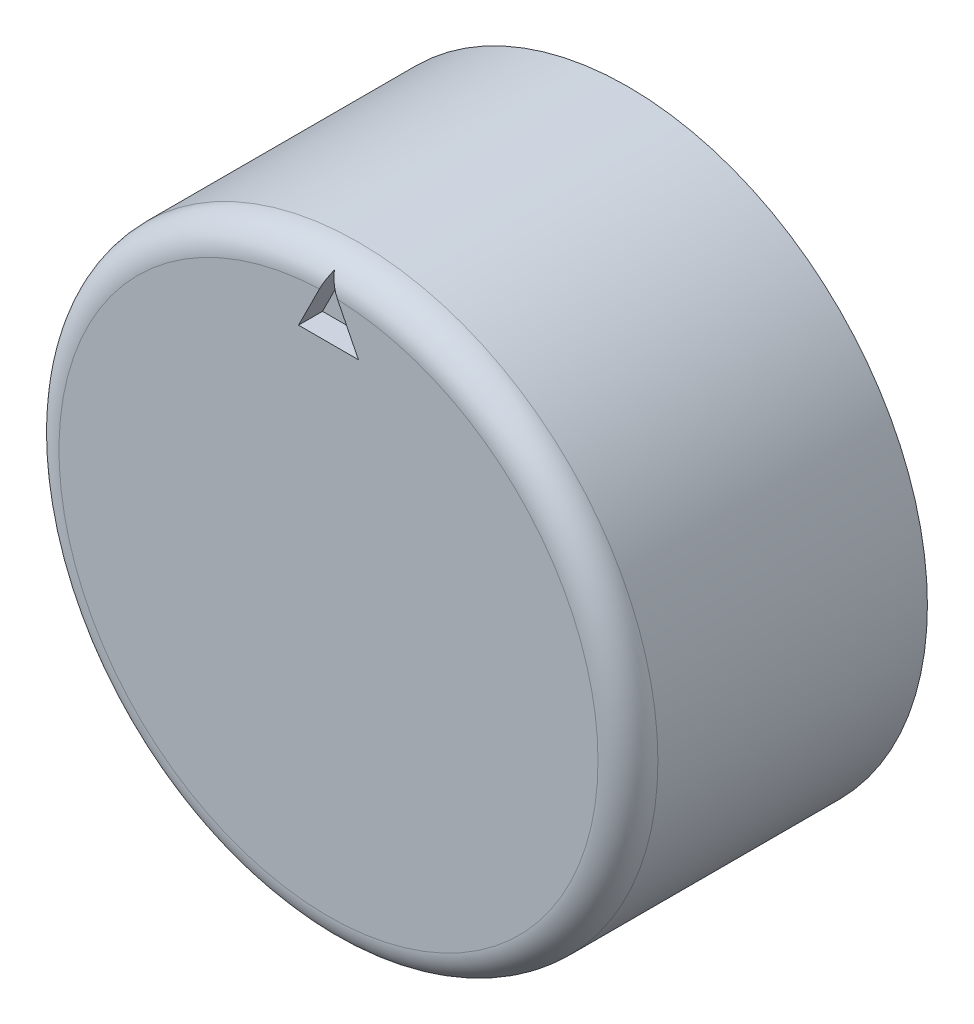
ISO-10303-21;
HEADER;
FILE_DESCRIPTION(('STEP AP214'),'2;1');
FILE_NAME('part.step','',(''),(''),'','','');
FILE_SCHEMA(('AUTOMOTIVE_DESIGN { 1 0 10303 214 1 1 1 1 }'));
ENDSEC;
DATA;
#1=APPLICATION_CONTEXT('core data for automotive mechanical design processes');
#2=APPLICATION_PROTOCOL_DEFINITION('international standard','automotive_design',2000,#1);
#3=PRODUCT_CONTEXT('',#1,'mechanical');
#4=PRODUCT('Part','Part','',(#3));
#5=PRODUCT_RELATED_PRODUCT_CATEGORY('part','',(#4));
#6=PRODUCT_DEFINITION_FORMATION('','',#4);
#7=PRODUCT_DEFINITION_CONTEXT('part definition',#1,'design');
#8=PRODUCT_DEFINITION('design','',#6,#7);
#9=PRODUCT_DEFINITION_SHAPE('','',#8);
#10=(LENGTH_UNIT() NAMED_UNIT(*) SI_UNIT(.MILLI.,.METRE.));
#11=(NAMED_UNIT(*) PLANE_ANGLE_UNIT() SI_UNIT($,.RADIAN.));
#12=(NAMED_UNIT(*) SI_UNIT($,.STERADIAN.) SOLID_ANGLE_UNIT());
#13=UNCERTAINTY_MEASURE_WITH_UNIT(LENGTH_MEASURE(1.E-05),#10,'distance_accuracy_value','');
#14=(GEOMETRIC_REPRESENTATION_CONTEXT(3) GLOBAL_UNCERTAINTY_ASSIGNED_CONTEXT((#13)) GLOBAL_UNIT_ASSIGNED_CONTEXT((#10,
#11,#12)) REPRESENTATION_CONTEXT('',''));
#15=CARTESIAN_POINT('',(0.,0.,0.));
#16=DIRECTION('',(0.,0.,1.));
#17=DIRECTION('',(1.,0.,0.));
#18=AXIS2_PLACEMENT_3D('',#15,#16,#17);
#19=CARTESIAN_POINT('',(0.,0.,12.7));
#20=DIRECTION('',(0.,0.,1.));
#21=DIRECTION('',(1.,0.,0.));
#22=AXIS2_PLACEMENT_3D('',#19,#20,#21);
#23=PLANE('',#22);
#24=DIRECTION('',(-0.447213595499958,-0.894427190999916,0.));
#25=VECTOR('',#24,1.);
#26=CARTESIAN_POINT('',(0.,12.192,12.7));
#27=LINE('',#26,#25);
#28=CARTESIAN_POINT('',(-0.384229973834575,11.4235400523308,12.7));
#29=VERTEX_POINT('',#28);
#30=CARTESIAN_POINT('',(-1.27,9.652,12.7));
#31=VERTEX_POINT('',#30);
#32=EDGE_CURVE('E124',#29,#31,#27,.T.);
#33=ORIENTED_EDGE('',*,*,#32,.F.);
#34=CARTESIAN_POINT('',(0.,0.,12.7));
#35=DIRECTION('',(0.,0.,1.));
#36=DIRECTION('',(1.,0.,0.));
#37=AXIS2_PLACEMENT_3D('',#34,#35,#36);
#38=CIRCLE('',#37,11.43);
#39=CARTESIAN_POINT('',(0.384229973834575,11.4235400523308,12.7));
#40=VERTEX_POINT('',#39);
#41=EDGE_CURVE('E218',#29,#40,#38,.T.);
#42=ORIENTED_EDGE('',*,*,#41,.T.);
#43=DIRECTION('',(0.447213595499958,-0.894427190999916,0.));
#44=VECTOR('',#43,1.);
#45=CARTESIAN_POINT('',(0.,12.192,12.7));
#46=LINE('',#45,#44);
#47=CARTESIAN_POINT('',(1.27,9.652,12.7));
#48=VERTEX_POINT('',#47);
#49=EDGE_CURVE('E143',#40,#48,#46,.T.);
#50=ORIENTED_EDGE('',*,*,#49,.T.);
#51=DIRECTION('',(1.,0.,0.));
#52=VECTOR('',#51,1.);
#53=CARTESIAN_POINT('',(-1.27,9.652,12.7));
#54=LINE('',#53,#52);
#55=EDGE_CURVE('E131',#31,#48,#54,.T.);
#56=ORIENTED_EDGE('',*,*,#55,.F.);
#57=EDGE_LOOP('',(#33,#42,#50,#56));
#58=FACE_BOUND('',#57,.T.);
#59=ADVANCED_FACE('F38',(#58),#23,.T.);
#60=CARTESIAN_POINT('',(0.,0.,12.7));
#61=DIRECTION('',(0.,0.,-1.));
#62=DIRECTION('',(-1.,0.,0.));
#63=AXIS2_PLACEMENT_3D('',#60,#61,#62);
#64=CYLINDRICAL_SURFACE('',#63,12.7);
#65=CARTESIAN_POINT('',(0.,0.,11.43));
#66=DIRECTION('',(0.,0.,1.));
#67=DIRECTION('',(1.,0.,0.));
#68=AXIS2_PLACEMENT_3D('',#65,#66,#67);
#69=CIRCLE('',#68,12.7);
#70=CARTESIAN_POINT('',(12.7,0.,11.43));
#71=VERTEX_POINT('',#70);
#72=EDGE_CURVE('E337',#71,#71,#69,.F.);
#73=ORIENTED_EDGE('',*,*,#72,.T.);
#74=EDGE_LOOP('',(#73));
#75=FACE_BOUND('',#74,.T.);
#76=CARTESIAN_POINT('',(0.,0.,0.));
#77=DIRECTION('',(0.,0.,1.));
#78=DIRECTION('',(1.,0.,0.));
#79=AXIS2_PLACEMENT_3D('',#76,#77,#78);
#80=CIRCLE('',#79,12.7);
#81=CARTESIAN_POINT('',(12.7,0.,0.));
#82=VERTEX_POINT('',#81);
#83=EDGE_CURVE('E182',#82,#82,#80,.T.);
#84=ORIENTED_EDGE('',*,*,#83,.T.);
#85=EDGE_LOOP('',(#84));
#86=FACE_BOUND('',#85,.T.);
#87=ADVANCED_FACE('F292',(#75,#86),#64,.T.);
#88=CARTESIAN_POINT('',(0.,0.,0.));
#89=DIRECTION('',(0.,0.,1.));
#90=DIRECTION('',(1.,0.,0.));
#91=AXIS2_PLACEMENT_3D('',#88,#89,#90);
#92=PLANE('',#91);
#93=CARTESIAN_POINT('',(0.,0.,0.));
#94=DIRECTION('',(0.,0.,1.));
#95=DIRECTION('',(1.,0.,0.));
#96=AXIS2_PLACEMENT_3D('',#93,#94,#95);
#97=CIRCLE('',#96,11.43);
#98=CARTESIAN_POINT('',(11.43,0.,0.));
#99=VERTEX_POINT('',#98);
#100=EDGE_CURVE('E214',#99,#99,#97,.T.);
#101=ORIENTED_EDGE('',*,*,#100,.T.);
#102=EDGE_LOOP('',(#101));
#103=FACE_BOUND('',#102,.T.);
#104=ORIENTED_EDGE('',*,*,#83,.F.);
#105=EDGE_LOOP('',(#104));
#106=FACE_BOUND('',#105,.T.);
#107=ADVANCED_FACE('F294',(#103,#106),#92,.F.);
#108=CARTESIAN_POINT('',(0.,0.,10.16));
#109=DIRECTION('',(0.,0.,-1.));
#110=DIRECTION('',(-1.,0.,0.));
#111=AXIS2_PLACEMENT_3D('',#108,#109,#110);
#112=CYLINDRICAL_SURFACE('',#111,10.16);
#113=CARTESIAN_POINT('',(0.,0.,8.89));
#114=DIRECTION('',(0.,0.,-1.));
#115=DIRECTION('',(-1.,0.,0.));
#116=AXIS2_PLACEMENT_3D('',#113,#114,#115);
#117=CIRCLE('',#116,10.16);
#118=CARTESIAN_POINT('',(-10.16,0.,8.89));
#119=VERTEX_POINT('',#118);
#120=EDGE_CURVE('E198',#119,#119,#117,.F.);
#121=ORIENTED_EDGE('',*,*,#120,.T.);
#122=EDGE_LOOP('',(#121));
#123=FACE_BOUND('',#122,.T.);
#124=CARTESIAN_POINT('',(0.,0.,1.27));
#125=DIRECTION('',(0.,0.,1.));
#126=DIRECTION('',(1.,0.,0.));
#127=AXIS2_PLACEMENT_3D('',#124,#125,#126);
#128=CIRCLE('',#127,10.16);
#129=CARTESIAN_POINT('',(10.16,0.,1.27));
#130=VERTEX_POINT('',#129);
#131=EDGE_CURVE('E194',#130,#130,#128,.F.);
#132=ORIENTED_EDGE('',*,*,#131,.T.);
#133=EDGE_LOOP('',(#132));
#134=FACE_BOUND('',#133,.T.);
#135=ADVANCED_FACE('F297',(#123,#134),#112,.F.);
#136=CARTESIAN_POINT('',(0.,0.,10.16));
#137=DIRECTION('',(0.,0.,-1.));
#138=DIRECTION('',(-1.,0.,0.));
#139=AXIS2_PLACEMENT_3D('',#136,#137,#138);
#140=PLANE('',#139);
#141=CARTESIAN_POINT('',(0.,0.,10.16));
#142=DIRECTION('',(0.,0.,-1.));
#143=DIRECTION('',(-1.,0.,0.));
#144=AXIS2_PLACEMENT_3D('',#141,#142,#143);
#145=CIRCLE('',#144,8.89);
#146=CARTESIAN_POINT('',(-8.89,0.,10.16));
#147=VERTEX_POINT('',#146);
#148=EDGE_CURVE('E190',#147,#147,#145,.T.);
#149=ORIENTED_EDGE('',*,*,#148,.T.);
#150=EDGE_LOOP('',(#149));
#151=FACE_BOUND('',#150,.T.);
#152=CARTESIAN_POINT('',(0.,0.,10.16));
#153=DIRECTION('',(0.,0.,-1.));
#154=DIRECTION('',(-1.,0.,0.));
#155=AXIS2_PLACEMENT_3D('',#152,#153,#154);
#156=CIRCLE('',#155,6.35);
#157=CARTESIAN_POINT('',(-6.35,0.,10.16));
#158=VERTEX_POINT('',#157);
#159=EDGE_CURVE('E186',#158,#158,#156,.F.);
#160=ORIENTED_EDGE('',*,*,#159,.T.);
#161=EDGE_LOOP('',(#160));
#162=FACE_BOUND('',#161,.T.);
#163=ADVANCED_FACE('F371',(#151,#162),#140,.T.);
#164=CARTESIAN_POINT('',(0.,0.,10.16));
#165=DIRECTION('',(0.,0.,-1.));
#166=DIRECTION('',(-1.,0.,0.));
#167=AXIS2_PLACEMENT_3D('',#164,#165,#166);
#168=CYLINDRICAL_SURFACE('',#167,5.08);
#169=CARTESIAN_POINT('',(0.,0.,8.89));
#170=DIRECTION('',(0.,0.,-1.));
#171=DIRECTION('',(-1.,0.,0.));
#172=AXIS2_PLACEMENT_3D('',#169,#170,#171);
#173=CIRCLE('',#172,5.08);
#174=CARTESIAN_POINT('',(-5.08,0.,8.89));
#175=VERTEX_POINT('',#174);
#176=EDGE_CURVE('E202',#175,#175,#173,.T.);
#177=ORIENTED_EDGE('',*,*,#176,.T.);
#178=EDGE_LOOP('',(#177));
#179=FACE_BOUND('',#178,.T.);
#180=CARTESIAN_POINT('',(0.,0.,0.));
#181=DIRECTION('',(0.,0.,-1.));
#182=DIRECTION('',(-1.,0.,0.));
#183=AXIS2_PLACEMENT_3D('',#180,#181,#182);
#184=CIRCLE('',#183,5.08);
#185=CARTESIAN_POINT('',(-5.08,0.,0.));
#186=VERTEX_POINT('',#185);
#187=EDGE_CURVE('E133',#186,#186,#184,.T.);
#188=ORIENTED_EDGE('',*,*,#187,.F.);
#189=EDGE_LOOP('',(#188));
#190=FACE_BOUND('',#189,.T.);
#191=ADVANCED_FACE('F369',(#179,#190),#168,.T.);
#192=CARTESIAN_POINT('',(0.,0.,7.62));
#193=DIRECTION('',(0.,0.,-1.));
#194=DIRECTION('',(-1.,0.,0.));
#195=AXIS2_PLACEMENT_3D('',#192,#193,#194);
#196=PLANE('',#195);
#197=CARTESIAN_POINT('',(0.,0.,7.62));
#198=DIRECTION('',(0.,0.,-1.));
#199=DIRECTION('',(-1.,0.,0.));
#200=AXIS2_PLACEMENT_3D('',#197,#198,#199);
#201=CIRCLE('',#200,3.0988);
#202=CARTESIAN_POINT('',(3.07528867588069,-0.381,7.62));
#203=VERTEX_POINT('',#202);
#204=CARTESIAN_POINT('',(-3.07528867588069,-0.381,7.62));
#205=VERTEX_POINT('',#204);
#206=EDGE_CURVE('E177',#203,#205,#201,.T.);
#207=ORIENTED_EDGE('',*,*,#206,.T.);
#208=DIRECTION('',(-1.,0.,0.));
#209=VECTOR('',#208,1.);
#210=CARTESIAN_POINT('',(3.07528867588069,-0.381,7.62));
#211=LINE('',#210,#209);
#212=EDGE_CURVE('E157',#203,#205,#211,.T.);
#213=ORIENTED_EDGE('',*,*,#212,.F.);
#214=EDGE_LOOP('',(#207,#213));
#215=FACE_BOUND('',#214,.T.);
#216=ADVANCED_FACE('F281',(#215),#196,.T.);
#217=CARTESIAN_POINT('',(-3.07528867588069,0.381,7.62));
#218=VERTEX_POINT('',#217);
#219=CARTESIAN_POINT('',(3.07528867588069,0.381,7.62));
#220=VERTEX_POINT('',#219);
#221=EDGE_CURVE('E178',#218,#220,#201,.T.);
#222=ORIENTED_EDGE('',*,*,#221,.T.);
#223=DIRECTION('',(1.,0.,0.));
#224=VECTOR('',#223,1.);
#225=CARTESIAN_POINT('',(3.07528867588069,0.381,7.62));
#226=LINE('',#225,#224);
#227=EDGE_CURVE('E161',#218,#220,#226,.T.);
#228=ORIENTED_EDGE('',*,*,#227,.F.);
#229=EDGE_LOOP('',(#222,#228));
#230=FACE_BOUND('',#229,.T.);
#231=ADVANCED_FACE('F377',(#230),#196,.T.);
#232=CARTESIAN_POINT('',(3.07528867588069,0.381,6.604));
#233=DIRECTION('',(0.,-1.,0.));
#234=DIRECTION('',(0.,0.,-1.));
#235=AXIS2_PLACEMENT_3D('',#232,#233,#234);
#236=PLANE('',#235);
#237=DIRECTION('',(0.,0.,1.));
#238=VECTOR('',#237,1.);
#239=CARTESIAN_POINT('',(3.07528867588069,0.381,6.604));
#240=LINE('',#239,#238);
#241=CARTESIAN_POINT('',(3.07528867588069,0.381,6.985));
#242=VERTEX_POINT('',#241);
#243=EDGE_CURVE('E165',#242,#220,#240,.T.);
#244=ORIENTED_EDGE('',*,*,#243,.F.);
#245=DIRECTION('',(1.,0.,0.));
#246=VECTOR('',#245,1.);
#247=CARTESIAN_POINT('',(-3.07528867588069,0.381,6.985));
#248=LINE('',#247,#246);
#249=CARTESIAN_POINT('',(-3.07528867588069,0.381,6.985));
#250=VERTEX_POINT('',#249);
#251=EDGE_CURVE('E331',#242,#250,#248,.F.);
#252=ORIENTED_EDGE('',*,*,#251,.T.);
#253=DIRECTION('',(0.,0.,1.));
#254=VECTOR('',#253,1.);
#255=CARTESIAN_POINT('',(-3.07528867588069,0.381,6.604));
#256=LINE('',#255,#254);
#257=EDGE_CURVE('E168',#250,#218,#256,.T.);
#258=ORIENTED_EDGE('',*,*,#257,.T.);
#259=ORIENTED_EDGE('',*,*,#227,.T.);
#260=EDGE_LOOP('',(#244,#252,#258,#259));
#261=FACE_BOUND('',#260,.T.);
#262=ADVANCED_FACE('F385',(#261),#236,.F.);
#263=CARTESIAN_POINT('',(3.07528867588069,-0.381,6.604));
#264=DIRECTION('',(0.,1.,0.));
#265=DIRECTION('',(0.,0.,1.));
#266=AXIS2_PLACEMENT_3D('',#263,#264,#265);
#267=PLANE('',#266);
#268=DIRECTION('',(0.,0.,1.));
#269=VECTOR('',#268,1.);
#270=CARTESIAN_POINT('',(-3.07528867588069,-0.381,6.604));
#271=LINE('',#270,#269);
#272=CARTESIAN_POINT('',(-3.07528867588069,-0.381,6.985));
#273=VERTEX_POINT('',#272);
#274=EDGE_CURVE('E171',#273,#205,#271,.T.);
#275=ORIENTED_EDGE('',*,*,#274,.F.);
#276=DIRECTION('',(-1.,0.,0.));
#277=VECTOR('',#276,1.);
#278=CARTESIAN_POINT('',(3.07528867588069,-0.381,6.985));
#279=LINE('',#278,#277);
#280=CARTESIAN_POINT('',(3.07528867588069,-0.381,6.985));
#281=VERTEX_POINT('',#280);
#282=EDGE_CURVE('E325',#273,#281,#279,.F.);
#283=ORIENTED_EDGE('',*,*,#282,.T.);
#284=DIRECTION('',(0.,0.,1.));
#285=VECTOR('',#284,1.);
#286=CARTESIAN_POINT('',(3.07528867588069,-0.381,6.604));
#287=LINE('',#286,#285);
#288=EDGE_CURVE('E174',#281,#203,#287,.T.);
#289=ORIENTED_EDGE('',*,*,#288,.T.);
#290=ORIENTED_EDGE('',*,*,#212,.T.);
#291=EDGE_LOOP('',(#275,#283,#289,#290));
#292=FACE_BOUND('',#291,.T.);
#293=ADVANCED_FACE('F279',(#292),#267,.F.);
#294=CARTESIAN_POINT('',(0.,0.,7.62));
#295=DIRECTION('',(0.,0.,-1.));
#296=DIRECTION('',(-1.,0.,0.));
#297=AXIS2_PLACEMENT_3D('',#294,#295,#296);
#298=CYLINDRICAL_SURFACE('',#297,3.0988);
#299=CARTESIAN_POINT('',(0.,0.,1.27));
#300=DIRECTION('',(0.,0.,1.));
#301=DIRECTION('',(1.,0.,0.));
#302=AXIS2_PLACEMENT_3D('',#299,#300,#301);
#303=CIRCLE('',#302,3.0988);
#304=CARTESIAN_POINT('',(3.0988,0.,1.27));
#305=VERTEX_POINT('',#304);
#306=EDGE_CURVE('E206',#305,#305,#303,.F.);
#307=ORIENTED_EDGE('',*,*,#306,.T.);
#308=EDGE_LOOP('',(#307));
#309=FACE_BOUND('',#308,.T.);
#310=ORIENTED_EDGE('',*,*,#288,.F.);
#311=CARTESIAN_POINT('',(3.07528867588069,-0.381,6.985));
#312=CARTESIAN_POINT('',(3.07528004081982,-0.381018589074796,6.96365102763824));
#313=CARTESIAN_POINT('',(3.07551074929636,-0.379206752701778,6.94230933167754));
#314=CARTESIAN_POINT('',(3.07638663364725,-0.372061725983508,6.90025565739909));
#315=CARTESIAN_POINT('',(3.07703135194932,-0.366732423034679,6.87954301027909));
#316=CARTESIAN_POINT('',(3.07867158435411,-0.352688954014093,6.83930587378407));
#317=CARTESIAN_POINT('',(3.07966722055165,-0.343973609729039,6.81978180072579));
#318=CARTESIAN_POINT('',(3.08189408091296,-0.323415405179685,6.78247385490974));
#319=CARTESIAN_POINT('',(3.08312529116536,-0.311572729578175,6.76468987948756));
#320=CARTESIAN_POINT('',(3.08569252850868,-0.285028028744537,6.73127262622608));
#321=CARTESIAN_POINT('',(3.08702902194415,-0.270312799563568,6.7156498719609));
#322=CARTESIAN_POINT('',(3.08965208956825,-0.238466333862675,6.68708670300817));
#323=CARTESIAN_POINT('',(3.09093865413554,-0.221334634605383,6.6741468032437));
#324=CARTESIAN_POINT('',(3.09332185700477,-0.185073647669207,6.65127867467624));
#325=CARTESIAN_POINT('',(3.09441783008622,-0.165937722708198,6.64136090688049));
#326=CARTESIAN_POINT('',(3.09629021737166,-0.126260213398592,6.62488887685476));
#327=CARTESIAN_POINT('',(3.09706683215826,-0.105719520842201,6.61833250275952));
#328=CARTESIAN_POINT('',(3.09802052968646,-0.0708803008762741,6.61037928555279));
#329=CARTESIAN_POINT('',(3.09831138126674,-0.0568036383074508,6.6079890015096));
#330=CARTESIAN_POINT('',(3.0987017145286,-0.028486722423065,6.60479930161022));
#331=CARTESIAN_POINT('',(3.09880143777597,-0.0142466985215964,6.6039978775606));
#332=CARTESIAN_POINT('',(3.0988,0.,6.604));
#333=B_SPLINE_CURVE_WITH_KNOTS('',3,(#311,#312,#313,#314,#315,#316,#317,#318,#319,#320,#321,
#322,#323,#324,#325,#326,#327,#328,#329,#330,#331,#332),.UNSPECIFIED.,.F.,.F.,(4,2,2,2,2,2,2,2,
2,2,4),(0.,0.0639581750281856,0.1278457835307,0.191755642424172,0.255661728409154,
0.319868791852831,0.384088167240981,0.448527374699549,0.512926047125005,0.555684463663021,
0.598388802401247),.UNSPECIFIED.);
#334=CARTESIAN_POINT('',(3.0988,0.,6.604));
#335=VERTEX_POINT('',#334);
#336=EDGE_CURVE('E11',#281,#335,#333,.T.);
#337=ORIENTED_EDGE('',*,*,#336,.T.);
#338=CARTESIAN_POINT('',(3.0988,0.,6.604));
#339=CARTESIAN_POINT('',(3.09880842259353,0.0213495724568772,6.60398141187423));
#340=CARTESIAN_POINT('',(3.09857960788471,0.0426919177424715,6.605793349217));
#341=CARTESIAN_POINT('',(3.09771001628497,0.0847470332666562,6.61293884047638));
#342=CARTESIAN_POINT('',(3.09706969229822,0.105460469463338,6.61826852296188));
#343=CARTESIAN_POINT('',(3.09543905352266,0.145699232537333,6.63231309744986));
#344=CARTESIAN_POINT('',(3.09444861574365,0.165224139071435,6.64102917915495));
#345=CARTESIAN_POINT('',(3.09223063211091,0.202533453354019,6.66158910604651));
#346=CARTESIAN_POINT('',(3.09100310076973,0.220317967531924,6.67343275980997));
#347=CARTESIAN_POINT('',(3.08844023609983,0.253734581895402,6.69997844473191));
#348=CARTESIAN_POINT('',(3.08710442981453,0.269356331606709,6.71469346050081));
#349=CARTESIAN_POINT('',(3.08447932801358,0.297917570880593,6.74653908815733));
#350=CARTESIAN_POINT('',(3.08319004155114,0.31085654064885,6.76367016708401));
#351=CARTESIAN_POINT('',(3.0807990954901,0.333723697663769,6.79993061664182));
#352=CARTESIAN_POINT('',(3.07969810432409,0.343641252625778,6.81906673269149));
#353=CARTESIAN_POINT('',(3.07781567682358,0.360112826120232,6.85874463404227));
#354=CARTESIAN_POINT('',(3.07703403926614,0.366668963329139,6.87928552464709));
#355=CARTESIAN_POINT('',(3.07607385918171,0.374621507554615,6.91412408904239));
#356=CARTESIAN_POINT('',(3.07578091373131,0.377011487615882,6.92819984323193));
#357=CARTESIAN_POINT('',(3.07538770184558,0.38020079432311,6.95651499037982));
#358=CARTESIAN_POINT('',(3.07528719279852,0.381002123885178,6.97075415449412));
#359=CARTESIAN_POINT('',(3.07528867588069,0.381,6.985));
#360=B_SPLINE_CURVE_WITH_KNOTS('',3,(#338,#339,#340,#341,#342,#343,#344,#345,#346,#347,#348,
#349,#350,#351,#352,#353,#354,#355,#356,#357,#358,#359),.UNSPECIFIED.,.F.,.F.,(4,2,2,2,2,2,2,2,
2,2,4),(0.,0.0639600677415119,0.127849861763877,0.191762121739452,0.255670470872073,
0.319874813645838,0.384091584547096,0.448531789745963,0.512931328680168,0.555687035382436,
0.598388802787427),.UNSPECIFIED.);
#361=EDGE_CURVE('E255',#335,#242,#360,.T.);
#362=ORIENTED_EDGE('',*,*,#361,.T.);
#363=ORIENTED_EDGE('',*,*,#243,.T.);
#364=ORIENTED_EDGE('',*,*,#221,.F.);
#365=ORIENTED_EDGE('',*,*,#257,.F.);
#366=CARTESIAN_POINT('',(-3.07528867588069,0.381,6.985));
#367=CARTESIAN_POINT('',(-3.07528004081982,0.381018589074796,6.96365102763824));
#368=CARTESIAN_POINT('',(-3.07551074929636,0.379206752701778,6.94230933167754));
#369=CARTESIAN_POINT('',(-3.07638663364725,0.372061725983508,6.90025565739909));
#370=CARTESIAN_POINT('',(-3.07703135194932,0.366732423034679,6.87954301027909));
#371=CARTESIAN_POINT('',(-3.07867158435411,0.352688954014093,6.83930587378407));
#372=CARTESIAN_POINT('',(-3.07966722055165,0.343973609729039,6.81978180072579));
#373=CARTESIAN_POINT('',(-3.08189408091296,0.323415405179685,6.78247385490974));
#374=CARTESIAN_POINT('',(-3.08312529116536,0.311572729578175,6.76468987948756));
#375=CARTESIAN_POINT('',(-3.08569252850868,0.285028028744537,6.73127262622608));
#376=CARTESIAN_POINT('',(-3.08702902194415,0.270312799563568,6.7156498719609));
#377=CARTESIAN_POINT('',(-3.08965208956825,0.238466333862675,6.68708670300817));
#378=CARTESIAN_POINT('',(-3.09093865413554,0.221334634605383,6.6741468032437));
#379=CARTESIAN_POINT('',(-3.09332185700477,0.185073647669207,6.65127867467624));
#380=CARTESIAN_POINT('',(-3.09441783008622,0.165937722708198,6.64136090688049));
#381=CARTESIAN_POINT('',(-3.09629021737166,0.126260213398592,6.62488887685476));
#382=CARTESIAN_POINT('',(-3.09706683215826,0.105719520842201,6.61833250275952));
#383=CARTESIAN_POINT('',(-3.09802052968646,0.0708803008762741,6.61037928555279));
#384=CARTESIAN_POINT('',(-3.09831138126674,0.0568036383074508,6.6079890015096));
#385=CARTESIAN_POINT('',(-3.0987017145286,0.028486722423065,6.60479930161022));
#386=CARTESIAN_POINT('',(-3.09880143777597,0.0142466985215964,6.6039978775606));
#387=CARTESIAN_POINT('',(-3.0988,0.,6.604));
#388=B_SPLINE_CURVE_WITH_KNOTS('',3,(#366,#367,#368,#369,#370,#371,#372,#373,#374,#375,#376,
#377,#378,#379,#380,#381,#382,#383,#384,#385,#386,#387),.UNSPECIFIED.,.F.,.F.,(4,2,2,2,2,2,2,2,
2,2,4),(0.,0.0639581750281856,0.1278457835307,0.191755642424172,0.255661728409154,
0.319868791852831,0.384088167240981,0.448527374699549,0.512926047125005,0.555684463663021,
0.598388802401247),.UNSPECIFIED.);
#389=CARTESIAN_POINT('',(-3.0988,0.,6.604));
#390=VERTEX_POINT('',#389);
#391=EDGE_CURVE('E56',#250,#390,#388,.T.);
#392=ORIENTED_EDGE('',*,*,#391,.T.);
#393=CARTESIAN_POINT('',(-3.0988,0.,6.604));
#394=CARTESIAN_POINT('',(-3.09880842259353,-0.0213495724568772,6.60398141187423));
#395=CARTESIAN_POINT('',(-3.09857960788471,-0.0426919177424715,6.605793349217));
#396=CARTESIAN_POINT('',(-3.09771001628497,-0.0847470332666562,6.61293884047638));
#397=CARTESIAN_POINT('',(-3.09706969229822,-0.105460469463338,6.61826852296188));
#398=CARTESIAN_POINT('',(-3.09543905352266,-0.145699232537333,6.63231309744986));
#399=CARTESIAN_POINT('',(-3.09444861574365,-0.165224139071435,6.64102917915495));
#400=CARTESIAN_POINT('',(-3.09223063211091,-0.202533453354019,6.66158910604651));
#401=CARTESIAN_POINT('',(-3.09100310076973,-0.220317967531924,6.67343275980997));
#402=CARTESIAN_POINT('',(-3.08844023609983,-0.253734581895402,6.69997844473191));
#403=CARTESIAN_POINT('',(-3.08710442981453,-0.269356331606709,6.71469346050081));
#404=CARTESIAN_POINT('',(-3.08447932801358,-0.297917570880593,6.74653908815733));
#405=CARTESIAN_POINT('',(-3.08319004155114,-0.31085654064885,6.76367016708401));
#406=CARTESIAN_POINT('',(-3.0807990954901,-0.333723697663769,6.79993061664182));
#407=CARTESIAN_POINT('',(-3.07969810432409,-0.343641252625778,6.81906673269149));
#408=CARTESIAN_POINT('',(-3.07781567682358,-0.360112826120232,6.85874463404227));
#409=CARTESIAN_POINT('',(-3.07703403926614,-0.366668963329139,6.87928552464709));
#410=CARTESIAN_POINT('',(-3.07607385918171,-0.374621507554615,6.91412408904239));
#411=CARTESIAN_POINT('',(-3.07578091373131,-0.377011487615882,6.92819984323193));
#412=CARTESIAN_POINT('',(-3.07538770184558,-0.38020079432311,6.95651499037982));
#413=CARTESIAN_POINT('',(-3.07528719279852,-0.381002123885178,6.97075415449412));
#414=CARTESIAN_POINT('',(-3.07528867588069,-0.381,6.985));
#415=B_SPLINE_CURVE_WITH_KNOTS('',3,(#393,#394,#395,#396,#397,#398,#399,#400,#401,#402,#403,
#404,#405,#406,#407,#408,#409,#410,#411,#412,#413,#414),.UNSPECIFIED.,.F.,.F.,(4,2,2,2,2,2,2,2,
2,2,4),(0.,0.0639600677415119,0.127849861763877,0.191762121739452,0.255670470872073,
0.319874813645838,0.384091584547096,0.448531789745963,0.512931328680168,0.555687035382436,
0.598388802787427),.UNSPECIFIED.);
#416=EDGE_CURVE('E49',#390,#273,#415,.T.);
#417=ORIENTED_EDGE('',*,*,#416,.T.);
#418=ORIENTED_EDGE('',*,*,#274,.T.);
#419=ORIENTED_EDGE('',*,*,#206,.F.);
#420=EDGE_LOOP('',(#310,#337,#362,#363,#364,#365,#392,#417,#418,#419));
#421=FACE_BOUND('',#420,.T.);
#422=ADVANCED_FACE('F273',(#309,#421),#298,.F.);
#423=CARTESIAN_POINT('',(0.,0.,0.));
#424=DIRECTION('',(0.,0.,1.));
#425=DIRECTION('',(1.,0.,0.));
#426=AXIS2_PLACEMENT_3D('',#423,#424,#425);
#427=CIRCLE('',#426,4.3688);
#428=CARTESIAN_POINT('',(4.3688,0.,0.));
#429=VERTEX_POINT('',#428);
#430=EDGE_CURVE('E210',#429,#429,#427,.T.);
#431=ORIENTED_EDGE('',*,*,#430,.T.);
#432=EDGE_LOOP('',(#431));
#433=FACE_BOUND('',#432,.T.);
#434=ORIENTED_EDGE('',*,*,#187,.T.);
#435=EDGE_LOOP('',(#434));
#436=FACE_BOUND('',#435,.T.);
#437=ADVANCED_FACE('F278',(#433,#436),#92,.F.);
#438=CARTESIAN_POINT('',(0.,12.192,11.684));
#439=DIRECTION('',(-0.894427190999916,-0.447213595499958,0.));
#440=DIRECTION('',(0.447213595499958,-0.894427190999916,0.));
#441=AXIS2_PLACEMENT_3D('',#438,#439,#440);
#442=PLANE('',#441);
#443=ORIENTED_EDGE('',*,*,#49,.F.);
#444=CARTESIAN_POINT('',(0.384229973834574,11.4235400523308,12.7));
#445=CARTESIAN_POINT('',(0.344102691156794,11.5037946176864,12.7000438328403));
#446=CARTESIAN_POINT('',(0.303917826236797,11.5841643475264,12.6926534540191));
#447=CARTESIAN_POINT('',(0.225662029978838,11.7406759400423,12.6633241511763));
#448=CARTESIAN_POINT('',(0.187563377457604,11.8168732450848,12.6417519697121));
#449=CARTESIAN_POINT('',(0.124270113077018,11.943459773846,12.5926600959781));
#450=CARTESIAN_POINT('',(0.0985259324498997,11.9949481351002,12.5686562369458));
#451=CARTESIAN_POINT('',(0.0481533023799257,12.0956933952401,12.5130600802199));
#452=CARTESIAN_POINT('',(0.0235535219622048,12.1448929560756,12.4813381636848));
#453=CARTESIAN_POINT('',(0.,12.192,12.446));
#454=B_SPLINE_CURVE_WITH_KNOTS('',3,(#444,#445,#446,#447,#448,#449,#450,#451,#452,#453),
.UNSPECIFIED.,.F.,.F.,(4,2,2,2,4),(0.,0.269095749621069,0.531492788901241,0.718124462935187,
0.908137836945549),.UNSPECIFIED.);
#455=CARTESIAN_POINT('',(0.,12.192,12.446));
#456=VERTEX_POINT('',#455);
#457=EDGE_CURVE('E222',#40,#456,#454,.T.);
#458=ORIENTED_EDGE('',*,*,#457,.T.);
#459=DIRECTION('',(0.,0.,1.));
#460=VECTOR('',#459,1.);
#461=CARTESIAN_POINT('',(0.,12.192,11.684));
#462=LINE('',#461,#460);
#463=CARTESIAN_POINT('',(0.,12.192,11.684));
#464=VERTEX_POINT('',#463);
#465=EDGE_CURVE('E117',#464,#456,#462,.T.);
#466=ORIENTED_EDGE('',*,*,#465,.F.);
#467=DIRECTION('',(0.447213595499958,-0.894427190999916,0.));
#468=VECTOR('',#467,1.);
#469=CARTESIAN_POINT('',(0.,12.192,11.684));
#470=LINE('',#469,#468);
#471=CARTESIAN_POINT('',(1.27,9.652,11.684));
#472=VERTEX_POINT('',#471);
#473=EDGE_CURVE('E110',#464,#472,#470,.T.);
#474=ORIENTED_EDGE('',*,*,#473,.T.);
#475=DIRECTION('',(0.,0.,1.));
#476=VECTOR('',#475,1.);
#477=CARTESIAN_POINT('',(1.27,9.652,11.684));
#478=LINE('',#477,#476);
#479=EDGE_CURVE('E114',#472,#48,#478,.T.);
#480=ORIENTED_EDGE('',*,*,#479,.T.);
#481=EDGE_LOOP('',(#443,#458,#466,#474,#480));
#482=FACE_BOUND('',#481,.T.);
#483=ADVANCED_FACE('F113',(#482),#442,.T.);
#484=CARTESIAN_POINT('',(-1.27,9.652,11.684));
#485=DIRECTION('',(0.,-1.,0.));
#486=DIRECTION('',(0.,0.,-1.));
#487=AXIS2_PLACEMENT_3D('',#484,#485,#486);
#488=PLANE('',#487);
#489=ORIENTED_EDGE('',*,*,#55,.T.);
#490=ORIENTED_EDGE('',*,*,#479,.F.);
#491=DIRECTION('',(1.,0.,0.));
#492=VECTOR('',#491,1.);
#493=CARTESIAN_POINT('',(-1.27,9.652,11.684));
#494=LINE('',#493,#492);
#495=CARTESIAN_POINT('',(-1.27,9.652,11.684));
#496=VERTEX_POINT('',#495);
#497=EDGE_CURVE('E123',#496,#472,#494,.T.);
#498=ORIENTED_EDGE('',*,*,#497,.F.);
#499=DIRECTION('',(0.,0.,1.));
#500=VECTOR('',#499,1.);
#501=CARTESIAN_POINT('',(-1.27,9.652,11.684));
#502=LINE('',#501,#500);
#503=EDGE_CURVE('E134',#496,#31,#502,.T.);
#504=ORIENTED_EDGE('',*,*,#503,.T.);
#505=EDGE_LOOP('',(#489,#490,#498,#504));
#506=FACE_BOUND('',#505,.T.);
#507=ADVANCED_FACE('F128',(#506),#488,.F.);
#508=CARTESIAN_POINT('',(0.,12.192,11.684));
#509=DIRECTION('',(-0.894427190999916,0.447213595499958,0.));
#510=DIRECTION('',(-0.447213595499958,-0.894427190999916,0.));
#511=AXIS2_PLACEMENT_3D('',#508,#509,#510);
#512=PLANE('',#511);
#513=ORIENTED_EDGE('',*,*,#465,.T.);
#514=CARTESIAN_POINT('',(0.,12.192,12.446));
#515=CARTESIAN_POINT('',(-0.0318752113577078,12.1282495772846,12.4938612029773));
#516=CARTESIAN_POINT('',(-0.0656726056324309,12.0606547887351,12.5350460272816));
#517=CARTESIAN_POINT('',(-0.135105338761713,11.9217893224766,12.603075288094));
#518=CARTESIAN_POINT('',(-0.170678960148484,11.850642079703,12.6302334764809));
#519=CARTESIAN_POINT('',(-0.235633987449238,11.7207320251015,12.6671413185108));
#520=CARTESIAN_POINT('',(-0.264744944351255,11.6625101112975,12.6793504697615));
#521=CARTESIAN_POINT('',(-0.323974928827602,11.5440501423448,12.6958565331783));
#522=CARTESIAN_POINT('',(-0.354102605863971,11.4837947882721,12.6999991540268));
#523=CARTESIAN_POINT('',(-0.384229973834575,11.4235400523308,12.7));
#524=B_SPLINE_CURVE_WITH_KNOTS('',3,(#514,#515,#516,#517,#518,#519,#520,#521,#522,#523),
.UNSPECIFIED.,.F.,.F.,(4,2,2,2,4),(0.,0.256997430484879,0.507965839219925,0.706173059916949,
0.908135598629714),.UNSPECIFIED.);
#525=EDGE_CURVE('E231',#456,#29,#524,.T.);
#526=ORIENTED_EDGE('',*,*,#525,.T.);
#527=ORIENTED_EDGE('',*,*,#32,.T.);
#528=ORIENTED_EDGE('',*,*,#503,.F.);
#529=DIRECTION('',(-0.447213595499958,-0.894427190999916,0.));
#530=VECTOR('',#529,1.);
#531=CARTESIAN_POINT('',(0.,12.192,11.684));
#532=LINE('',#531,#530);
#533=EDGE_CURVE('E137',#464,#496,#532,.T.);
#534=ORIENTED_EDGE('',*,*,#533,.F.);
#535=EDGE_LOOP('',(#513,#526,#527,#528,#534));
#536=FACE_BOUND('',#535,.T.);
#537=ADVANCED_FACE('F346',(#536),#512,.F.);
#538=CARTESIAN_POINT('',(0.,0.,11.684));
#539=DIRECTION('',(0.,0.,1.));
#540=DIRECTION('',(1.,0.,0.));
#541=AXIS2_PLACEMENT_3D('',#538,#539,#540);
#542=PLANE('',#541);
#543=ORIENTED_EDGE('',*,*,#473,.F.);
#544=ORIENTED_EDGE('',*,*,#533,.T.);
#545=ORIENTED_EDGE('',*,*,#497,.T.);
#546=EDGE_LOOP('',(#543,#544,#545));
#547=FACE_BOUND('',#546,.T.);
#548=ADVANCED_FACE('F136',(#547),#542,.T.);
#549=CARTESIAN_POINT('',(0.,0.,8.89));
#550=DIRECTION('',(0.,0.,-1.));
#551=DIRECTION('',(-1.,0.,0.));
#552=AXIS2_PLACEMENT_3D('',#549,#550,#551);
#553=TOROIDAL_SURFACE('',#552,8.89,1.27);
#554=ORIENTED_EDGE('',*,*,#120,.F.);
#555=EDGE_LOOP('',(#554));
#556=FACE_BOUND('',#555,.T.);
#557=ORIENTED_EDGE('',*,*,#148,.F.);
#558=EDGE_LOOP('',(#557));
#559=FACE_BOUND('',#558,.T.);
#560=ADVANCED_FACE('F302',(#556,#559),#553,.F.);
#561=CARTESIAN_POINT('',(0.,0.,8.89));
#562=DIRECTION('',(0.,0.,-1.));
#563=DIRECTION('',(-1.,0.,0.));
#564=AXIS2_PLACEMENT_3D('',#561,#562,#563);
#565=TOROIDAL_SURFACE('',#564,6.35,1.27);
#566=ORIENTED_EDGE('',*,*,#159,.F.);
#567=EDGE_LOOP('',(#566));
#568=FACE_BOUND('',#567,.T.);
#569=ORIENTED_EDGE('',*,*,#176,.F.);
#570=EDGE_LOOP('',(#569));
#571=FACE_BOUND('',#570,.T.);
#572=ADVANCED_FACE('F305',(#568,#571),#565,.F.);
#573=CARTESIAN_POINT('',(0.,0.,1.27));
#574=DIRECTION('',(0.,0.,1.));
#575=DIRECTION('',(1.,0.,0.));
#576=AXIS2_PLACEMENT_3D('',#573,#574,#575);
#577=TOROIDAL_SURFACE('',#576,4.3688,1.27);
#578=ORIENTED_EDGE('',*,*,#430,.F.);
#579=EDGE_LOOP('',(#578));
#580=FACE_BOUND('',#579,.T.);
#581=ORIENTED_EDGE('',*,*,#306,.F.);
#582=EDGE_LOOP('',(#581));
#583=FACE_BOUND('',#582,.T.);
#584=ADVANCED_FACE('F308',(#580,#583),#577,.T.);
#585=CARTESIAN_POINT('',(0.,0.,1.27));
#586=DIRECTION('',(0.,0.,1.));
#587=DIRECTION('',(1.,0.,0.));
#588=AXIS2_PLACEMENT_3D('',#585,#586,#587);
#589=TOROIDAL_SURFACE('',#588,11.43,1.27);
#590=ORIENTED_EDGE('',*,*,#100,.F.);
#591=EDGE_LOOP('',(#590));
#592=FACE_BOUND('',#591,.T.);
#593=ORIENTED_EDGE('',*,*,#131,.F.);
#594=EDGE_LOOP('',(#593));
#595=FACE_BOUND('',#594,.T.);
#596=ADVANCED_FACE('F245',(#592,#595),#589,.T.);
#597=CARTESIAN_POINT('',(0.,0.,11.43));
#598=DIRECTION('',(0.,0.,1.));
#599=DIRECTION('',(1.,0.,0.));
#600=AXIS2_PLACEMENT_3D('',#597,#598,#599);
#601=TOROIDAL_SURFACE('',#600,11.43,1.27);
#602=ORIENTED_EDGE('',*,*,#72,.F.);
#603=EDGE_LOOP('',(#602));
#604=FACE_BOUND('',#603,.T.);
#605=ORIENTED_EDGE('',*,*,#457,.F.);
#606=ORIENTED_EDGE('',*,*,#41,.F.);
#607=ORIENTED_EDGE('',*,*,#525,.F.);
#608=EDGE_LOOP('',(#605,#606,#607));
#609=FACE_BOUND('',#608,.T.);
#610=ADVANCED_FACE('F241',(#604,#609),#601,.T.);
#611=CARTESIAN_POINT('',(0.,0.,6.985));
#612=DIRECTION('',(1.,0.,0.));
#613=DIRECTION('',(0.,0.,-1.));
#614=AXIS2_PLACEMENT_3D('',#611,#612,#613);
#615=CYLINDRICAL_SURFACE('',#614,0.381);
#616=ORIENTED_EDGE('',*,*,#282,.F.);
#617=ORIENTED_EDGE('',*,*,#416,.F.);
#618=DIRECTION('',(-1.,0.,0.));
#619=VECTOR('',#618,1.);
#620=CARTESIAN_POINT('',(-3.07528867588069,0.,6.604));
#621=LINE('',#620,#619);
#622=EDGE_CURVE('E43',#335,#390,#621,.T.);
#623=ORIENTED_EDGE('',*,*,#622,.F.);
#624=ORIENTED_EDGE('',*,*,#336,.F.);
#625=EDGE_LOOP('',(#616,#617,#623,#624));
#626=FACE_BOUND('',#625,.T.);
#627=ADVANCED_FACE('F40',(#626),#615,.T.);
#628=CARTESIAN_POINT('',(0.,0.,6.985));
#629=DIRECTION('',(-1.,0.,0.));
#630=DIRECTION('',(0.,0.,1.));
#631=AXIS2_PLACEMENT_3D('',#628,#629,#630);
#632=CYLINDRICAL_SURFACE('',#631,0.381);
#633=ORIENTED_EDGE('',*,*,#391,.F.);
#634=ORIENTED_EDGE('',*,*,#251,.F.);
#635=ORIENTED_EDGE('',*,*,#361,.F.);
#636=ORIENTED_EDGE('',*,*,#622,.T.);
#637=EDGE_LOOP('',(#633,#634,#635,#636));
#638=FACE_BOUND('',#637,.T.);
#639=ADVANCED_FACE('F248',(#638),#632,.T.);
#640=CLOSED_SHELL('',(#59,#87,#107,#135,#163,#191,#216,#231,#262,#293,#422,#437,#483,#507,#537,
#548,#560,#572,#584,#596,#610,#627,#639));
#641=MANIFOLD_SOLID_BREP('B2',#640);
#642=ADVANCED_BREP_SHAPE_REPRESENTATION('',(#18,#641),#14);
#643=SHAPE_DEFINITION_REPRESENTATION(#9,#642);
ENDSEC;
END-ISO-10303-21;
